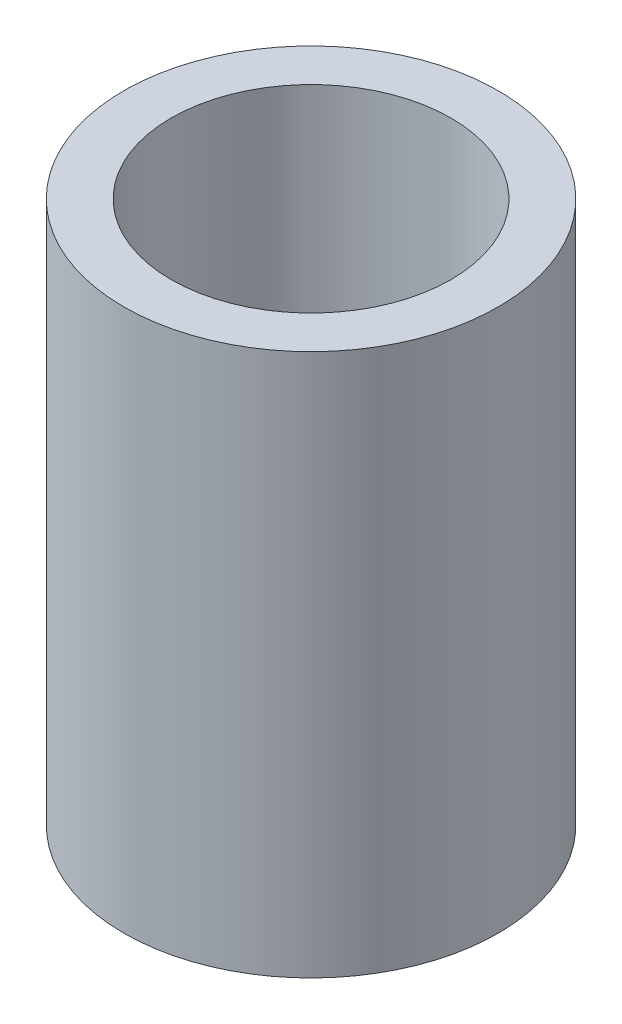
ISO-10303-21;
HEADER;
FILE_DESCRIPTION(('STEP AP214'),'2;1');
FILE_NAME('part.step','',(''),(''),'','','');
FILE_SCHEMA(('AUTOMOTIVE_DESIGN { 1 0 10303 214 1 1 1 1 }'));
ENDSEC;
DATA;
#1=APPLICATION_CONTEXT('core data for automotive mechanical design processes');
#2=APPLICATION_PROTOCOL_DEFINITION('international standard','automotive_design',2000,#1);
#3=PRODUCT_CONTEXT('',#1,'mechanical');
#4=PRODUCT('Part','Part','',(#3));
#5=PRODUCT_RELATED_PRODUCT_CATEGORY('part','',(#4));
#6=PRODUCT_DEFINITION_FORMATION('','',#4);
#7=PRODUCT_DEFINITION_CONTEXT('part definition',#1,'design');
#8=PRODUCT_DEFINITION('design','',#6,#7);
#9=PRODUCT_DEFINITION_SHAPE('','',#8);
#10=(LENGTH_UNIT() NAMED_UNIT(*) SI_UNIT(.MILLI.,.METRE.));
#11=(NAMED_UNIT(*) PLANE_ANGLE_UNIT() SI_UNIT($,.RADIAN.));
#12=(NAMED_UNIT(*) SI_UNIT($,.STERADIAN.) SOLID_ANGLE_UNIT());
#13=UNCERTAINTY_MEASURE_WITH_UNIT(LENGTH_MEASURE(1.E-05),#10,'distance_accuracy_value','');
#14=(GEOMETRIC_REPRESENTATION_CONTEXT(3) GLOBAL_UNCERTAINTY_ASSIGNED_CONTEXT((#13)) GLOBAL_UNIT_ASSIGNED_CONTEXT((#10,
#11,#12)) REPRESENTATION_CONTEXT('',''));
#15=CARTESIAN_POINT('',(0.,0.,0.));
#16=DIRECTION('',(0.,0.,1.));
#17=DIRECTION('',(1.,0.,0.));
#18=AXIS2_PLACEMENT_3D('',#15,#16,#17);
#19=CARTESIAN_POINT('',(0.,12.6492,0.));
#20=DIRECTION('',(0.,1.,0.));
#21=DIRECTION('',(0.,0.,1.));
#22=AXIS2_PLACEMENT_3D('',#19,#20,#21);
#23=PLANE('',#22);
#24=CARTESIAN_POINT('',(0.,12.6492,0.));
#25=DIRECTION('',(0.,1.,0.));
#26=DIRECTION('',(0.,0.,1.));
#27=AXIS2_PLACEMENT_3D('',#24,#25,#26);
#28=CIRCLE('',#27,4.36626);
#29=CARTESIAN_POINT('',(0.,12.6492,4.36626));
#30=VERTEX_POINT('',#29);
#31=EDGE_CURVE('E10',#30,#30,#28,.T.);
#32=ORIENTED_EDGE('',*,*,#31,.T.);
#33=EDGE_LOOP('',(#32));
#34=FACE_BOUND('',#33,.T.);
#35=CARTESIAN_POINT('',(0.,12.6492,0.));
#36=DIRECTION('',(0.,1.,0.));
#37=DIRECTION('',(0.,0.,1.));
#38=AXIS2_PLACEMENT_3D('',#35,#36,#37);
#39=CIRCLE('',#38,3.2639);
#40=CARTESIAN_POINT('',(0.,12.6492,3.2639));
#41=VERTEX_POINT('',#40);
#42=EDGE_CURVE('E46',#41,#41,#39,.T.);
#43=ORIENTED_EDGE('',*,*,#42,.F.);
#44=EDGE_LOOP('',(#43));
#45=FACE_BOUND('',#44,.T.);
#46=ADVANCED_FACE('F35',(#34,#45),#23,.T.);
#47=CARTESIAN_POINT('',(0.,0.,0.));
#48=DIRECTION('',(0.,1.,0.));
#49=DIRECTION('',(0.,0.,1.));
#50=AXIS2_PLACEMENT_3D('',#47,#48,#49);
#51=PLANE('',#50);
#52=CARTESIAN_POINT('',(0.,0.,0.));
#53=DIRECTION('',(0.,1.,0.));
#54=DIRECTION('',(0.,0.,1.));
#55=AXIS2_PLACEMENT_3D('',#52,#53,#54);
#56=CIRCLE('',#55,4.36626);
#57=CARTESIAN_POINT('',(0.,0.,4.36626));
#58=VERTEX_POINT('',#57);
#59=EDGE_CURVE('E39',#58,#58,#56,.T.);
#60=ORIENTED_EDGE('',*,*,#59,.F.);
#61=EDGE_LOOP('',(#60));
#62=FACE_BOUND('',#61,.T.);
#63=CARTESIAN_POINT('',(0.,0.,0.));
#64=DIRECTION('',(0.,1.,0.));
#65=DIRECTION('',(0.,0.,1.));
#66=AXIS2_PLACEMENT_3D('',#63,#64,#65);
#67=CIRCLE('',#66,3.2639);
#68=CARTESIAN_POINT('',(0.,0.,3.2639));
#69=VERTEX_POINT('',#68);
#70=EDGE_CURVE('E48',#69,#69,#67,.T.);
#71=ORIENTED_EDGE('',*,*,#70,.T.);
#72=EDGE_LOOP('',(#71));
#73=FACE_BOUND('',#72,.T.);
#74=ADVANCED_FACE('F58',(#62,#73),#51,.F.);
#75=CARTESIAN_POINT('',(0.,12.6492,0.));
#76=DIRECTION('',(0.,-1.,0.));
#77=DIRECTION('',(0.,0.,-1.));
#78=AXIS2_PLACEMENT_3D('',#75,#76,#77);
#79=CYLINDRICAL_SURFACE('',#78,4.36626);
#80=ORIENTED_EDGE('',*,*,#31,.F.);
#81=EDGE_LOOP('',(#80));
#82=FACE_BOUND('',#81,.T.);
#83=ORIENTED_EDGE('',*,*,#59,.T.);
#84=EDGE_LOOP('',(#83));
#85=FACE_BOUND('',#84,.T.);
#86=ADVANCED_FACE('F37',(#82,#85),#79,.T.);
#87=CARTESIAN_POINT('',(0.,12.6492,0.));
#88=DIRECTION('',(0.,-1.,0.));
#89=DIRECTION('',(0.,0.,-1.));
#90=AXIS2_PLACEMENT_3D('',#87,#88,#89);
#91=CYLINDRICAL_SURFACE('',#90,3.2639);
#92=ORIENTED_EDGE('',*,*,#42,.T.);
#93=EDGE_LOOP('',(#92));
#94=FACE_BOUND('',#93,.T.);
#95=ORIENTED_EDGE('',*,*,#70,.F.);
#96=EDGE_LOOP('',(#95));
#97=FACE_BOUND('',#96,.T.);
#98=ADVANCED_FACE('F54',(#94,#97),#91,.F.);
#99=CLOSED_SHELL('',(#46,#74,#86,#98));
#100=MANIFOLD_SOLID_BREP('B2',#99);
#101=ADVANCED_BREP_SHAPE_REPRESENTATION('',(#18,#100),#14);
#102=SHAPE_DEFINITION_REPRESENTATION(#9,#101);
ENDSEC;
END-ISO-10303-21;
